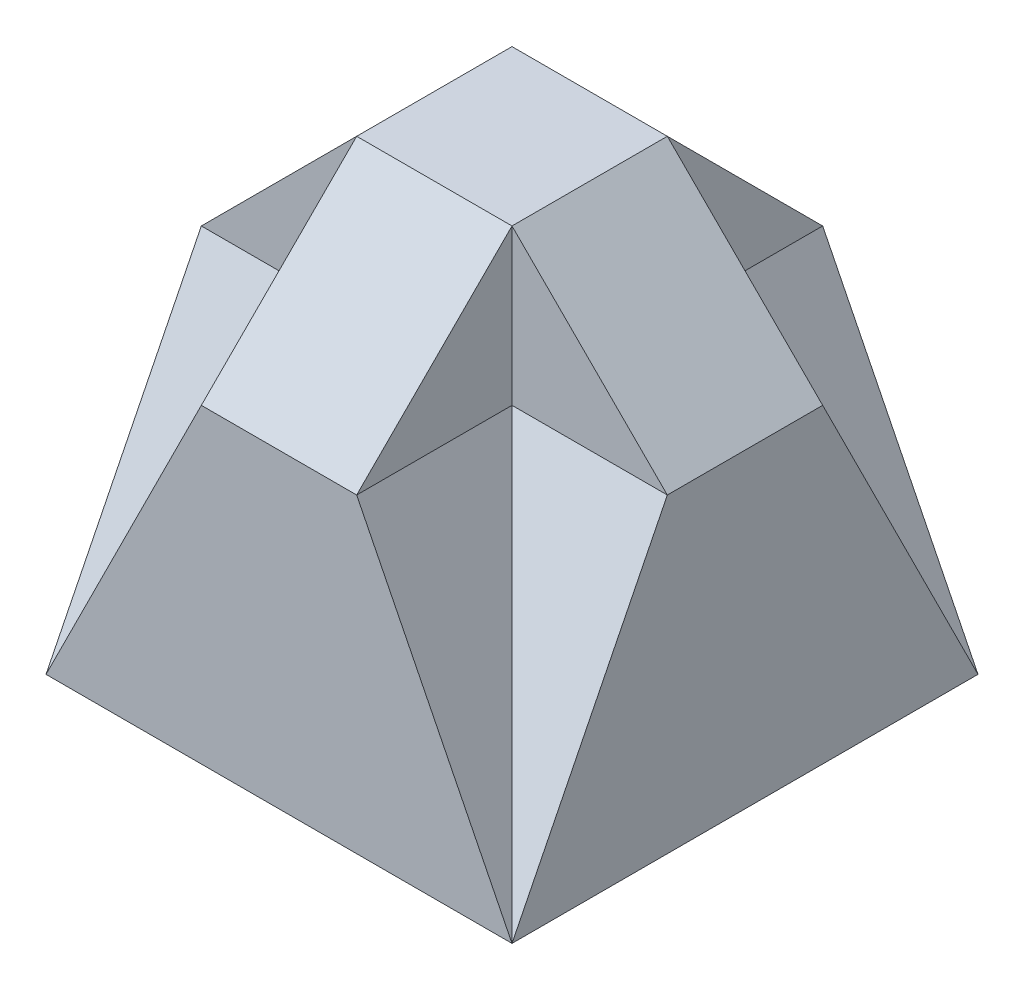
ISO-10303-21;
HEADER;
FILE_DESCRIPTION(('STEP AP214'),'2;1');
FILE_NAME('part.step','',(''),(''),'','','');
FILE_SCHEMA(('AUTOMOTIVE_DESIGN { 1 0 10303 214 1 1 1 1 }'));
ENDSEC;
DATA;
#1=APPLICATION_CONTEXT('core data for automotive mechanical design processes');
#2=APPLICATION_PROTOCOL_DEFINITION('international standard','automotive_design',2000,#1);
#3=PRODUCT_CONTEXT('',#1,'mechanical');
#4=PRODUCT('Part','Part','',(#3));
#5=PRODUCT_RELATED_PRODUCT_CATEGORY('part','',(#4));
#6=PRODUCT_DEFINITION_FORMATION('','',#4);
#7=PRODUCT_DEFINITION_CONTEXT('part definition',#1,'design');
#8=PRODUCT_DEFINITION('design','',#6,#7);
#9=PRODUCT_DEFINITION_SHAPE('','',#8);
#10=(LENGTH_UNIT() NAMED_UNIT(*) SI_UNIT(.MILLI.,.METRE.));
#11=(NAMED_UNIT(*) PLANE_ANGLE_UNIT() SI_UNIT($,.RADIAN.));
#12=(NAMED_UNIT(*) SI_UNIT($,.STERADIAN.) SOLID_ANGLE_UNIT());
#13=UNCERTAINTY_MEASURE_WITH_UNIT(LENGTH_MEASURE(1.E-05),#10,'distance_accuracy_value','');
#14=(GEOMETRIC_REPRESENTATION_CONTEXT(3) GLOBAL_UNCERTAINTY_ASSIGNED_CONTEXT((#13)) GLOBAL_UNIT_ASSIGNED_CONTEXT((#10,
#11,#12)) REPRESENTATION_CONTEXT('',''));
#15=CARTESIAN_POINT('',(0.,0.,0.));
#16=DIRECTION('',(0.,0.,1.));
#17=DIRECTION('',(1.,0.,0.));
#18=AXIS2_PLACEMENT_3D('',#15,#16,#17);
#19=CARTESIAN_POINT('',(45.,60.,45.));
#20=DIRECTION('',(-1.,0.,0.));
#21=DIRECTION('',(0.,0.,1.));
#22=AXIS2_PLACEMENT_3D('',#19,#20,#21);
#23=PLANE('',#22);
#24=DIRECTION('',(0.,0.,-1.));
#25=VECTOR('',#24,1.);
#26=CARTESIAN_POINT('',(45.,0.,45.));
#27=LINE('',#26,#25);
#28=CARTESIAN_POINT('',(45.,0.,45.));
#29=VERTEX_POINT('',#28);
#30=CARTESIAN_POINT('',(45.,0.,-45.));
#31=VERTEX_POINT('',#30);
#32=EDGE_CURVE('E260',#29,#31,#27,.T.);
#33=ORIENTED_EDGE('',*,*,#32,.T.);
#34=DIRECTION('',(0.,-0.894427190999916,-0.447213595499958));
#35=VECTOR('',#34,1.);
#36=CARTESIAN_POINT('',(45.,60.,-15.));
#37=LINE('',#36,#35);
#38=CARTESIAN_POINT('',(45.,60.,-15.));
#39=VERTEX_POINT('',#38);
#40=EDGE_CURVE('E342',#39,#31,#37,.T.);
#41=ORIENTED_EDGE('',*,*,#40,.F.);
#42=DIRECTION('',(0.,0.,1.));
#43=VECTOR('',#42,1.);
#44=CARTESIAN_POINT('',(45.,60.,0.));
#45=LINE('',#44,#43);
#46=CARTESIAN_POINT('',(45.,60.,15.));
#47=VERTEX_POINT('',#46);
#48=EDGE_CURVE('E186',#47,#39,#45,.F.);
#49=ORIENTED_EDGE('',*,*,#48,.F.);
#50=DIRECTION('',(0.,-0.894427190999916,0.447213595499958));
#51=VECTOR('',#50,1.);
#52=CARTESIAN_POINT('',(45.,60.,15.));
#53=LINE('',#52,#51);
#54=EDGE_CURVE('E341',#47,#29,#53,.T.);
#55=ORIENTED_EDGE('',*,*,#54,.T.);
#56=EDGE_LOOP('',(#33,#41,#49,#55));
#57=FACE_BOUND('',#56,.T.);
#58=ADVANCED_FACE('F67',(#57),#23,.F.);
#59=CARTESIAN_POINT('',(-45.,60.,-45.));
#60=DIRECTION('',(0.,0.,1.));
#61=DIRECTION('',(1.,0.,0.));
#62=AXIS2_PLACEMENT_3D('',#59,#60,#61);
#63=PLANE('',#62);
#64=DIRECTION('',(-1.,0.,0.));
#65=VECTOR('',#64,1.);
#66=CARTESIAN_POINT('',(-45.,0.,-45.));
#67=LINE('',#66,#65);
#68=CARTESIAN_POINT('',(-45.,0.,-45.));
#69=VERTEX_POINT('',#68);
#70=EDGE_CURVE('E322',#31,#69,#67,.T.);
#71=ORIENTED_EDGE('',*,*,#70,.T.);
#72=DIRECTION('',(-0.447213595499958,-0.894427190999916,0.));
#73=VECTOR('',#72,1.);
#74=CARTESIAN_POINT('',(-15.,60.,-45.));
#75=LINE('',#74,#73);
#76=CARTESIAN_POINT('',(-15.,60.,-45.));
#77=VERTEX_POINT('',#76);
#78=EDGE_CURVE('E151',#77,#69,#75,.T.);
#79=ORIENTED_EDGE('',*,*,#78,.F.);
#80=DIRECTION('',(1.,0.,0.));
#81=VECTOR('',#80,1.);
#82=CARTESIAN_POINT('',(0.,60.,-45.));
#83=LINE('',#82,#81);
#84=CARTESIAN_POINT('',(15.,60.,-45.));
#85=VERTEX_POINT('',#84);
#86=EDGE_CURVE('E180',#85,#77,#83,.F.);
#87=ORIENTED_EDGE('',*,*,#86,.F.);
#88=DIRECTION('',(0.447213595499958,-0.894427190999916,0.));
#89=VECTOR('',#88,1.);
#90=CARTESIAN_POINT('',(15.,60.,-45.));
#91=LINE('',#90,#89);
#92=EDGE_CURVE('E347',#85,#31,#91,.T.);
#93=ORIENTED_EDGE('',*,*,#92,.T.);
#94=EDGE_LOOP('',(#71,#79,#87,#93));
#95=FACE_BOUND('',#94,.T.);
#96=ADVANCED_FACE('F368',(#95),#63,.F.);
#97=CARTESIAN_POINT('',(-45.,60.,45.));
#98=DIRECTION('',(1.,0.,0.));
#99=DIRECTION('',(0.,0.,-1.));
#100=AXIS2_PLACEMENT_3D('',#97,#98,#99);
#101=PLANE('',#100);
#102=DIRECTION('',(0.,0.,1.));
#103=VECTOR('',#102,1.);
#104=CARTESIAN_POINT('',(-45.,60.,0.));
#105=LINE('',#104,#103);
#106=CARTESIAN_POINT('',(-45.,60.,-15.));
#107=VERTEX_POINT('',#106);
#108=CARTESIAN_POINT('',(-45.,60.,15.));
#109=VERTEX_POINT('',#108);
#110=EDGE_CURVE('E167',#107,#109,#105,.T.);
#111=ORIENTED_EDGE('',*,*,#110,.F.);
#112=DIRECTION('',(0.,-0.894427190999916,-0.447213595499958));
#113=VECTOR('',#112,1.);
#114=CARTESIAN_POINT('',(-45.,60.,-15.));
#115=LINE('',#114,#113);
#116=EDGE_CURVE('E141',#107,#69,#115,.T.);
#117=ORIENTED_EDGE('',*,*,#116,.T.);
#118=DIRECTION('',(0.,0.,1.));
#119=VECTOR('',#118,1.);
#120=CARTESIAN_POINT('',(-45.,0.,45.));
#121=LINE('',#120,#119);
#122=CARTESIAN_POINT('',(-45.,0.,45.));
#123=VERTEX_POINT('',#122);
#124=EDGE_CURVE('E323',#69,#123,#121,.T.);
#125=ORIENTED_EDGE('',*,*,#124,.T.);
#126=DIRECTION('',(0.,-0.894427190999916,0.447213595499958));
#127=VECTOR('',#126,1.);
#128=CARTESIAN_POINT('',(-45.,60.,15.));
#129=LINE('',#128,#127);
#130=EDGE_CURVE('E177',#109,#123,#129,.T.);
#131=ORIENTED_EDGE('',*,*,#130,.F.);
#132=EDGE_LOOP('',(#111,#117,#125,#131));
#133=FACE_BOUND('',#132,.T.);
#134=ADVANCED_FACE('F176',(#133),#101,.F.);
#135=CARTESIAN_POINT('',(-45.,60.,45.));
#136=DIRECTION('',(0.,0.,-1.));
#137=DIRECTION('',(-1.,0.,0.));
#138=AXIS2_PLACEMENT_3D('',#135,#136,#137);
#139=PLANE('',#138);
#140=DIRECTION('',(1.,0.,0.));
#141=VECTOR('',#140,1.);
#142=CARTESIAN_POINT('',(-45.,0.,45.));
#143=LINE('',#142,#141);
#144=EDGE_CURVE('E199',#123,#29,#143,.T.);
#145=ORIENTED_EDGE('',*,*,#144,.T.);
#146=DIRECTION('',(0.447213595499958,-0.894427190999916,0.));
#147=VECTOR('',#146,1.);
#148=CARTESIAN_POINT('',(15.,60.,45.));
#149=LINE('',#148,#147);
#150=CARTESIAN_POINT('',(15.,60.,45.));
#151=VERTEX_POINT('',#150);
#152=EDGE_CURVE('E481',#151,#29,#149,.T.);
#153=ORIENTED_EDGE('',*,*,#152,.F.);
#154=DIRECTION('',(1.,0.,0.));
#155=VECTOR('',#154,1.);
#156=CARTESIAN_POINT('',(0.,60.,45.));
#157=LINE('',#156,#155);
#158=CARTESIAN_POINT('',(-15.,60.,45.));
#159=VERTEX_POINT('',#158);
#160=EDGE_CURVE('E179',#159,#151,#157,.T.);
#161=ORIENTED_EDGE('',*,*,#160,.F.);
#162=DIRECTION('',(-0.447213595499958,-0.894427190999916,0.));
#163=VECTOR('',#162,1.);
#164=CARTESIAN_POINT('',(-15.,60.,45.));
#165=LINE('',#164,#163);
#166=EDGE_CURVE('E253',#159,#123,#165,.T.);
#167=ORIENTED_EDGE('',*,*,#166,.T.);
#168=EDGE_LOOP('',(#145,#153,#161,#167));
#169=FACE_BOUND('',#168,.T.);
#170=ADVANCED_FACE('F486',(#169),#139,.F.);
#171=CARTESIAN_POINT('',(0.,0.,0.));
#172=DIRECTION('',(0.,-1.,0.));
#173=DIRECTION('',(0.,0.,-1.));
#174=AXIS2_PLACEMENT_3D('',#171,#172,#173);
#175=PLANE('',#174);
#176=ORIENTED_EDGE('',*,*,#32,.F.);
#177=ORIENTED_EDGE('',*,*,#144,.F.);
#178=ORIENTED_EDGE('',*,*,#124,.F.);
#179=ORIENTED_EDGE('',*,*,#70,.F.);
#180=EDGE_LOOP('',(#176,#177,#178,#179));
#181=FACE_BOUND('',#180,.T.);
#182=ADVANCED_FACE('F290',(#181),#175,.T.);
#183=CARTESIAN_POINT('',(0.,90.,0.));
#184=DIRECTION('',(0.,-1.,0.));
#185=DIRECTION('',(0.,0.,-1.));
#186=AXIS2_PLACEMENT_3D('',#183,#184,#185);
#187=PLANE('',#186);
#188=DIRECTION('',(0.,0.,-1.));
#189=VECTOR('',#188,1.);
#190=CARTESIAN_POINT('',(15.,90.,15.));
#191=LINE('',#190,#189);
#192=CARTESIAN_POINT('',(15.,90.,15.));
#193=VERTEX_POINT('',#192);
#194=CARTESIAN_POINT('',(15.,90.,-15.));
#195=VERTEX_POINT('',#194);
#196=EDGE_CURVE('E245',#193,#195,#191,.T.);
#197=ORIENTED_EDGE('',*,*,#196,.T.);
#198=DIRECTION('',(-1.,0.,0.));
#199=VECTOR('',#198,1.);
#200=CARTESIAN_POINT('',(-15.,90.,-15.));
#201=LINE('',#200,#199);
#202=CARTESIAN_POINT('',(-15.,90.,-15.));
#203=VERTEX_POINT('',#202);
#204=EDGE_CURVE('E246',#195,#203,#201,.T.);
#205=ORIENTED_EDGE('',*,*,#204,.T.);
#206=DIRECTION('',(0.,0.,1.));
#207=VECTOR('',#206,1.);
#208=CARTESIAN_POINT('',(-15.,90.,15.));
#209=LINE('',#208,#207);
#210=CARTESIAN_POINT('',(-15.,90.,15.));
#211=VERTEX_POINT('',#210);
#212=EDGE_CURVE('E169',#203,#211,#209,.T.);
#213=ORIENTED_EDGE('',*,*,#212,.T.);
#214=DIRECTION('',(1.,0.,0.));
#215=VECTOR('',#214,1.);
#216=CARTESIAN_POINT('',(-15.,90.,15.));
#217=LINE('',#216,#215);
#218=EDGE_CURVE('E256',#211,#193,#217,.T.);
#219=ORIENTED_EDGE('',*,*,#218,.T.);
#220=EDGE_LOOP('',(#197,#205,#213,#219));
#221=FACE_BOUND('',#220,.T.);
#222=ADVANCED_FACE('F280',(#221),#187,.F.);
#223=CARTESIAN_POINT('',(-52.5,52.5,0.));
#224=DIRECTION('',(-0.707106781186548,0.707106781186547,0.));
#225=DIRECTION('',(-0.707106781186547,-0.707106781186548,0.));
#226=AXIS2_PLACEMENT_3D('',#223,#224,#225);
#227=PLANE('',#226);
#228=DIRECTION('',(-0.707106781186547,-0.707106781186548,0.));
#229=VECTOR('',#228,1.);
#230=CARTESIAN_POINT('',(-52.5,52.5,15.));
#231=LINE('',#230,#229);
#232=EDGE_CURVE('E172',#211,#109,#231,.T.);
#233=ORIENTED_EDGE('',*,*,#232,.F.);
#234=ORIENTED_EDGE('',*,*,#212,.F.);
#235=DIRECTION('',(0.707106781186547,0.707106781186548,0.));
#236=VECTOR('',#235,1.);
#237=CARTESIAN_POINT('',(-52.5,52.5,-15.));
#238=LINE('',#237,#236);
#239=EDGE_CURVE('E156',#107,#203,#238,.T.);
#240=ORIENTED_EDGE('',*,*,#239,.F.);
#241=ORIENTED_EDGE('',*,*,#110,.T.);
#242=EDGE_LOOP('',(#233,#234,#240,#241));
#243=FACE_BOUND('',#242,.T.);
#244=ADVANCED_FACE('F166',(#243),#227,.T.);
#245=CARTESIAN_POINT('',(0.,52.5,52.5));
#246=DIRECTION('',(0.,0.707106781186547,0.707106781186548));
#247=DIRECTION('',(0.,-0.707106781186548,0.707106781186547));
#248=AXIS2_PLACEMENT_3D('',#245,#246,#247);
#249=PLANE('',#248);
#250=DIRECTION('',(0.,0.707106781186548,-0.707106781186547));
#251=VECTOR('',#250,1.);
#252=CARTESIAN_POINT('',(-15.,52.5,52.5));
#253=LINE('',#252,#251);
#254=EDGE_CURVE('E12',#159,#211,#253,.T.);
#255=ORIENTED_EDGE('',*,*,#254,.F.);
#256=ORIENTED_EDGE('',*,*,#160,.T.);
#257=DIRECTION('',(0.,-0.707106781186548,0.707106781186547));
#258=VECTOR('',#257,1.);
#259=CARTESIAN_POINT('',(15.,52.5,52.5));
#260=LINE('',#259,#258);
#261=EDGE_CURVE('E173',#193,#151,#260,.T.);
#262=ORIENTED_EDGE('',*,*,#261,.F.);
#263=ORIENTED_EDGE('',*,*,#218,.F.);
#264=EDGE_LOOP('',(#255,#256,#262,#263));
#265=FACE_BOUND('',#264,.T.);
#266=ADVANCED_FACE('F490',(#265),#249,.T.);
#267=CARTESIAN_POINT('',(0.,52.5,-52.5));
#268=DIRECTION('',(0.,0.707106781186548,-0.707106781186547));
#269=DIRECTION('',(0.,0.707106781186547,0.707106781186548));
#270=AXIS2_PLACEMENT_3D('',#267,#268,#269);
#271=PLANE('',#270);
#272=DIRECTION('',(0.,0.707106781186547,0.707106781186548));
#273=VECTOR('',#272,1.);
#274=CARTESIAN_POINT('',(15.,52.5,-52.5));
#275=LINE('',#274,#273);
#276=EDGE_CURVE('E215',#85,#195,#275,.T.);
#277=ORIENTED_EDGE('',*,*,#276,.F.);
#278=ORIENTED_EDGE('',*,*,#86,.T.);
#279=DIRECTION('',(0.,-0.707106781186547,-0.707106781186548));
#280=VECTOR('',#279,1.);
#281=CARTESIAN_POINT('',(-15.,52.5,-52.5));
#282=LINE('',#281,#280);
#283=EDGE_CURVE('E78',#203,#77,#282,.T.);
#284=ORIENTED_EDGE('',*,*,#283,.F.);
#285=ORIENTED_EDGE('',*,*,#204,.F.);
#286=EDGE_LOOP('',(#277,#278,#284,#285));
#287=FACE_BOUND('',#286,.T.);
#288=ADVANCED_FACE('F362',(#287),#271,.T.);
#289=CARTESIAN_POINT('',(52.5,52.5,0.));
#290=DIRECTION('',(0.707106781186547,0.707106781186548,0.));
#291=DIRECTION('',(-0.707106781186548,0.707106781186547,0.));
#292=AXIS2_PLACEMENT_3D('',#289,#290,#291);
#293=PLANE('',#292);
#294=DIRECTION('',(-0.707106781186548,0.707106781186547,0.));
#295=VECTOR('',#294,1.);
#296=CARTESIAN_POINT('',(52.5,52.5,15.));
#297=LINE('',#296,#295);
#298=EDGE_CURVE('E203',#47,#193,#297,.T.);
#299=ORIENTED_EDGE('',*,*,#298,.F.);
#300=ORIENTED_EDGE('',*,*,#48,.T.);
#301=DIRECTION('',(0.707106781186548,-0.707106781186547,0.));
#302=VECTOR('',#301,1.);
#303=CARTESIAN_POINT('',(52.5,52.5,-15.));
#304=LINE('',#303,#302);
#305=EDGE_CURVE('E183',#195,#39,#304,.T.);
#306=ORIENTED_EDGE('',*,*,#305,.F.);
#307=ORIENTED_EDGE('',*,*,#196,.F.);
#308=EDGE_LOOP('',(#299,#300,#306,#307));
#309=FACE_BOUND('',#308,.T.);
#310=ADVANCED_FACE('F336',(#309),#293,.T.);
#311=CARTESIAN_POINT('',(15.,60.,-15.));
#312=DIRECTION('',(-1.,0.,0.));
#313=DIRECTION('',(0.,0.,1.));
#314=AXIS2_PLACEMENT_3D('',#311,#312,#313);
#315=PLANE('',#314);
#316=ORIENTED_EDGE('',*,*,#276,.T.);
#317=DIRECTION('',(0.,1.,0.));
#318=VECTOR('',#317,1.);
#319=CARTESIAN_POINT('',(15.,60.,-15.));
#320=LINE('',#319,#318);
#321=CARTESIAN_POINT('',(15.,60.,-15.));
#322=VERTEX_POINT('',#321);
#323=EDGE_CURVE('E219',#322,#195,#320,.T.);
#324=ORIENTED_EDGE('',*,*,#323,.F.);
#325=CARTESIAN_POINT('',(15.,60.,-45.));
#326=DIRECTION('',(0.,0.,1.));
#327=VECTOR('',#326,1.);
#328=LINE('',#325,#327);
#329=EDGE_CURVE('E357',#85,#322,#328,.T.);
#330=ORIENTED_EDGE('',*,*,#329,.F.);
#331=EDGE_LOOP('',(#316,#324,#330));
#332=FACE_BOUND('',#331,.T.);
#333=ADVANCED_FACE('F356',(#332),#315,.F.);
#334=CARTESIAN_POINT('',(15.,60.,-15.));
#335=DIRECTION('',(0.,0.,1.));
#336=DIRECTION('',(1.,0.,0.));
#337=AXIS2_PLACEMENT_3D('',#334,#335,#336);
#338=PLANE('',#337);
#339=ORIENTED_EDGE('',*,*,#305,.T.);
#340=CARTESIAN_POINT('',(15.,60.,-15.));
#341=DIRECTION('',(1.,0.,0.));
#342=VECTOR('',#341,1.);
#343=LINE('',#340,#342);
#344=EDGE_CURVE('E222',#322,#39,#343,.T.);
#345=ORIENTED_EDGE('',*,*,#344,.F.);
#346=ORIENTED_EDGE('',*,*,#323,.T.);
#347=EDGE_LOOP('',(#339,#345,#346));
#348=FACE_BOUND('',#347,.T.);
#349=ADVANCED_FACE('F351',(#348),#338,.F.);
#350=CARTESIAN_POINT('',(15.,60.,15.));
#351=DIRECTION('',(-1.,0.,0.));
#352=DIRECTION('',(0.,0.,1.));
#353=AXIS2_PLACEMENT_3D('',#350,#351,#352);
#354=PLANE('',#353);
#355=ORIENTED_EDGE('',*,*,#261,.T.);
#356=CARTESIAN_POINT('',(15.,60.,15.));
#357=DIRECTION('',(0.,0.,1.));
#358=VECTOR('',#357,1.);
#359=LINE('',#356,#358);
#360=CARTESIAN_POINT('',(15.,60.,15.));
#361=VERTEX_POINT('',#360);
#362=EDGE_CURVE('E223',#361,#151,#359,.T.);
#363=ORIENTED_EDGE('',*,*,#362,.F.);
#364=DIRECTION('',(0.,1.,0.));
#365=VECTOR('',#364,1.);
#366=CARTESIAN_POINT('',(15.,60.,15.));
#367=LINE('',#366,#365);
#368=EDGE_CURVE('E229',#361,#193,#367,.T.);
#369=ORIENTED_EDGE('',*,*,#368,.T.);
#370=EDGE_LOOP('',(#355,#363,#369));
#371=FACE_BOUND('',#370,.T.);
#372=ADVANCED_FACE('F406',(#371),#354,.F.);
#373=CARTESIAN_POINT('',(15.,60.,15.));
#374=DIRECTION('',(0.,0.,-1.));
#375=DIRECTION('',(-1.,0.,0.));
#376=AXIS2_PLACEMENT_3D('',#373,#374,#375);
#377=PLANE('',#376);
#378=ORIENTED_EDGE('',*,*,#298,.T.);
#379=ORIENTED_EDGE('',*,*,#368,.F.);
#380=CARTESIAN_POINT('',(45.,60.,15.));
#381=DIRECTION('',(-1.,0.,0.));
#382=VECTOR('',#381,1.);
#383=LINE('',#380,#382);
#384=EDGE_CURVE('E471',#47,#361,#383,.T.);
#385=ORIENTED_EDGE('',*,*,#384,.F.);
#386=EDGE_LOOP('',(#378,#379,#385));
#387=FACE_BOUND('',#386,.T.);
#388=ADVANCED_FACE('F435',(#387),#377,.F.);
#389=CARTESIAN_POINT('',(-15.,60.,-15.));
#390=DIRECTION('',(1.,0.,0.));
#391=DIRECTION('',(0.,0.,-1.));
#392=AXIS2_PLACEMENT_3D('',#389,#390,#391);
#393=PLANE('',#392);
#394=ORIENTED_EDGE('',*,*,#283,.T.);
#395=CARTESIAN_POINT('',(-15.,60.,-15.));
#396=DIRECTION('',(0.,0.,-1.));
#397=VECTOR('',#396,1.);
#398=LINE('',#395,#397);
#399=CARTESIAN_POINT('',(-15.,60.,-15.));
#400=VERTEX_POINT('',#399);
#401=EDGE_CURVE('E160',#400,#77,#398,.T.);
#402=ORIENTED_EDGE('',*,*,#401,.F.);
#403=DIRECTION('',(0.,1.,0.));
#404=VECTOR('',#403,1.);
#405=CARTESIAN_POINT('',(-15.,60.,-15.));
#406=LINE('',#405,#404);
#407=EDGE_CURVE('E158',#400,#203,#406,.T.);
#408=ORIENTED_EDGE('',*,*,#407,.T.);
#409=EDGE_LOOP('',(#394,#402,#408));
#410=FACE_BOUND('',#409,.T.);
#411=ADVANCED_FACE('F291',(#410),#393,.F.);
#412=CARTESIAN_POINT('',(-15.,60.,-15.));
#413=DIRECTION('',(0.,0.,1.));
#414=DIRECTION('',(1.,0.,0.));
#415=AXIS2_PLACEMENT_3D('',#412,#413,#414);
#416=PLANE('',#415);
#417=ORIENTED_EDGE('',*,*,#239,.T.);
#418=ORIENTED_EDGE('',*,*,#407,.F.);
#419=CARTESIAN_POINT('',(-45.,60.,-15.));
#420=DIRECTION('',(1.,0.,0.));
#421=VECTOR('',#420,1.);
#422=LINE('',#419,#421);
#423=EDGE_CURVE('E144',#107,#400,#422,.T.);
#424=ORIENTED_EDGE('',*,*,#423,.F.);
#425=EDGE_LOOP('',(#417,#418,#424));
#426=FACE_BOUND('',#425,.T.);
#427=ADVANCED_FACE('F155',(#426),#416,.F.);
#428=CARTESIAN_POINT('',(-15.,60.,15.));
#429=DIRECTION('',(1.,0.,0.));
#430=DIRECTION('',(0.,0.,-1.));
#431=AXIS2_PLACEMENT_3D('',#428,#429,#430);
#432=PLANE('',#431);
#433=ORIENTED_EDGE('',*,*,#254,.T.);
#434=DIRECTION('',(0.,1.,0.));
#435=VECTOR('',#434,1.);
#436=CARTESIAN_POINT('',(-15.,60.,15.));
#437=LINE('',#436,#435);
#438=CARTESIAN_POINT('',(-15.,60.,15.));
#439=VERTEX_POINT('',#438);
#440=EDGE_CURVE('E249',#439,#211,#437,.T.);
#441=ORIENTED_EDGE('',*,*,#440,.F.);
#442=CARTESIAN_POINT('',(-15.,60.,45.));
#443=DIRECTION('',(0.,0.,-1.));
#444=VECTOR('',#443,1.);
#445=LINE('',#442,#444);
#446=EDGE_CURVE('E467',#159,#439,#445,.T.);
#447=ORIENTED_EDGE('',*,*,#446,.F.);
#448=EDGE_LOOP('',(#433,#441,#447));
#449=FACE_BOUND('',#448,.T.);
#450=ADVANCED_FACE('F445',(#449),#432,.F.);
#451=CARTESIAN_POINT('',(-15.,60.,15.));
#452=DIRECTION('',(0.,0.,-1.));
#453=DIRECTION('',(-1.,0.,0.));
#454=AXIS2_PLACEMENT_3D('',#451,#452,#453);
#455=PLANE('',#454);
#456=ORIENTED_EDGE('',*,*,#232,.T.);
#457=CARTESIAN_POINT('',(-15.,60.,15.));
#458=DIRECTION('',(-1.,0.,0.));
#459=VECTOR('',#458,1.);
#460=LINE('',#457,#459);
#461=EDGE_CURVE('E252',#439,#109,#460,.T.);
#462=ORIENTED_EDGE('',*,*,#461,.F.);
#463=ORIENTED_EDGE('',*,*,#440,.T.);
#464=EDGE_LOOP('',(#456,#462,#463));
#465=FACE_BOUND('',#464,.T.);
#466=ADVANCED_FACE('F448',(#465),#455,.F.);
#467=CARTESIAN_POINT('',(0.,18.,36.));
#468=DIRECTION('',(0.,-0.447213595499958,-0.894427190999916));
#469=DIRECTION('',(0.,0.894427190999916,-0.447213595499958));
#470=AXIS2_PLACEMENT_3D('',#467,#468,#469);
#471=PLANE('',#470);
#472=DIRECTION('',(-0.408248290463863,-0.816496580927726,0.408248290463863));
#473=VECTOR('',#472,1.);
#474=CARTESIAN_POINT('',(-15.,60.,15.));
#475=LINE('',#474,#473);
#476=EDGE_CURVE('E640',#439,#123,#475,.T.);
#477=ORIENTED_EDGE('',*,*,#476,.F.);
#478=ORIENTED_EDGE('',*,*,#461,.T.);
#479=ORIENTED_EDGE('',*,*,#130,.T.);
#480=EDGE_LOOP('',(#477,#478,#479));
#481=FACE_BOUND('',#480,.T.);
#482=ADVANCED_FACE('F647',(#481),#471,.F.);
#483=CARTESIAN_POINT('',(-36.,18.,0.));
#484=DIRECTION('',(0.894427190999916,-0.447213595499958,0.));
#485=DIRECTION('',(0.447213595499958,0.894427190999916,0.));
#486=AXIS2_PLACEMENT_3D('',#483,#484,#485);
#487=PLANE('',#486);
#488=ORIENTED_EDGE('',*,*,#166,.F.);
#489=ORIENTED_EDGE('',*,*,#446,.T.);
#490=ORIENTED_EDGE('',*,*,#476,.T.);
#491=EDGE_LOOP('',(#488,#489,#490));
#492=FACE_BOUND('',#491,.T.);
#493=ADVANCED_FACE('F400',(#492),#487,.F.);
#494=CARTESIAN_POINT('',(36.,18.,0.));
#495=DIRECTION('',(-0.894427190999916,-0.447213595499958,0.));
#496=DIRECTION('',(0.447213595499958,-0.894427190999916,0.));
#497=AXIS2_PLACEMENT_3D('',#494,#495,#496);
#498=PLANE('',#497);
#499=DIRECTION('',(0.408248290463863,-0.816496580927726,0.408248290463863));
#500=VECTOR('',#499,1.);
#501=CARTESIAN_POINT('',(15.,60.,15.));
#502=LINE('',#501,#500);
#503=EDGE_CURVE('E482',#361,#29,#502,.T.);
#504=ORIENTED_EDGE('',*,*,#503,.F.);
#505=ORIENTED_EDGE('',*,*,#362,.T.);
#506=ORIENTED_EDGE('',*,*,#152,.T.);
#507=EDGE_LOOP('',(#504,#505,#506));
#508=FACE_BOUND('',#507,.T.);
#509=ADVANCED_FACE('F480',(#508),#498,.F.);
#510=CARTESIAN_POINT('',(0.,18.,36.));
#511=DIRECTION('',(0.,-0.447213595499958,-0.894427190999916));
#512=DIRECTION('',(0.,0.894427190999916,-0.447213595499958));
#513=AXIS2_PLACEMENT_3D('',#510,#511,#512);
#514=PLANE('',#513);
#515=ORIENTED_EDGE('',*,*,#54,.F.);
#516=ORIENTED_EDGE('',*,*,#384,.T.);
#517=ORIENTED_EDGE('',*,*,#503,.T.);
#518=EDGE_LOOP('',(#515,#516,#517));
#519=FACE_BOUND('',#518,.T.);
#520=ADVANCED_FACE('F562',(#519),#514,.F.);
#521=CARTESIAN_POINT('',(36.,18.,0.));
#522=DIRECTION('',(-0.894427190999916,-0.447213595499958,0.));
#523=DIRECTION('',(0.447213595499958,-0.894427190999916,0.));
#524=AXIS2_PLACEMENT_3D('',#521,#522,#523);
#525=PLANE('',#524);
#526=ORIENTED_EDGE('',*,*,#92,.F.);
#527=ORIENTED_EDGE('',*,*,#329,.T.);
#528=DIRECTION('',(0.408248290463863,-0.816496580927726,-0.408248290463863));
#529=VECTOR('',#528,1.);
#530=CARTESIAN_POINT('',(15.,60.,-15.));
#531=LINE('',#530,#529);
#532=EDGE_CURVE('E346',#322,#31,#531,.T.);
#533=ORIENTED_EDGE('',*,*,#532,.T.);
#534=EDGE_LOOP('',(#526,#527,#533));
#535=FACE_BOUND('',#534,.T.);
#536=ADVANCED_FACE('F558',(#535),#525,.F.);
#537=CARTESIAN_POINT('',(0.,18.,-36.));
#538=DIRECTION('',(0.,-0.447213595499958,0.894427190999916));
#539=DIRECTION('',(0.,-0.894427190999916,-0.447213595499958));
#540=AXIS2_PLACEMENT_3D('',#537,#538,#539);
#541=PLANE('',#540);
#542=ORIENTED_EDGE('',*,*,#532,.F.);
#543=ORIENTED_EDGE('',*,*,#344,.T.);
#544=ORIENTED_EDGE('',*,*,#40,.T.);
#545=EDGE_LOOP('',(#542,#543,#544));
#546=FACE_BOUND('',#545,.T.);
#547=ADVANCED_FACE('F561',(#546),#541,.F.);
#548=CARTESIAN_POINT('',(0.,18.,-36.));
#549=DIRECTION('',(0.,-0.447213595499958,0.894427190999916));
#550=DIRECTION('',(0.,-0.894427190999916,-0.447213595499958));
#551=AXIS2_PLACEMENT_3D('',#548,#549,#550);
#552=PLANE('',#551);
#553=ORIENTED_EDGE('',*,*,#116,.F.);
#554=ORIENTED_EDGE('',*,*,#423,.T.);
#555=DIRECTION('',(-0.408248290463863,-0.816496580927726,-0.408248290463863));
#556=VECTOR('',#555,1.);
#557=CARTESIAN_POINT('',(-15.,60.,-15.));
#558=LINE('',#557,#556);
#559=EDGE_CURVE('E85',#400,#69,#558,.T.);
#560=ORIENTED_EDGE('',*,*,#559,.T.);
#561=EDGE_LOOP('',(#553,#554,#560));
#562=FACE_BOUND('',#561,.T.);
#563=ADVANCED_FACE('F143',(#562),#552,.F.);
#564=CARTESIAN_POINT('',(-36.,18.,0.));
#565=DIRECTION('',(0.894427190999916,-0.447213595499958,0.));
#566=DIRECTION('',(0.447213595499958,0.894427190999916,0.));
#567=AXIS2_PLACEMENT_3D('',#564,#565,#566);
#568=PLANE('',#567);
#569=ORIENTED_EDGE('',*,*,#559,.F.);
#570=ORIENTED_EDGE('',*,*,#401,.T.);
#571=ORIENTED_EDGE('',*,*,#78,.T.);
#572=EDGE_LOOP('',(#569,#570,#571));
#573=FACE_BOUND('',#572,.T.);
#574=ADVANCED_FACE('F582',(#573),#568,.F.);
#575=CLOSED_SHELL('',(#58,#96,#134,#170,#182,#222,#244,#266,#288,#310,#333,#349,#372,#388,#411,
#427,#450,#466,#482,#493,#509,#520,#536,#547,#563,#574));
#576=MANIFOLD_SOLID_BREP('B2',#575);
#577=ADVANCED_BREP_SHAPE_REPRESENTATION('',(#18,#576),#14);
#578=SHAPE_DEFINITION_REPRESENTATION(#9,#577);
ENDSEC;
END-ISO-10303-21;
